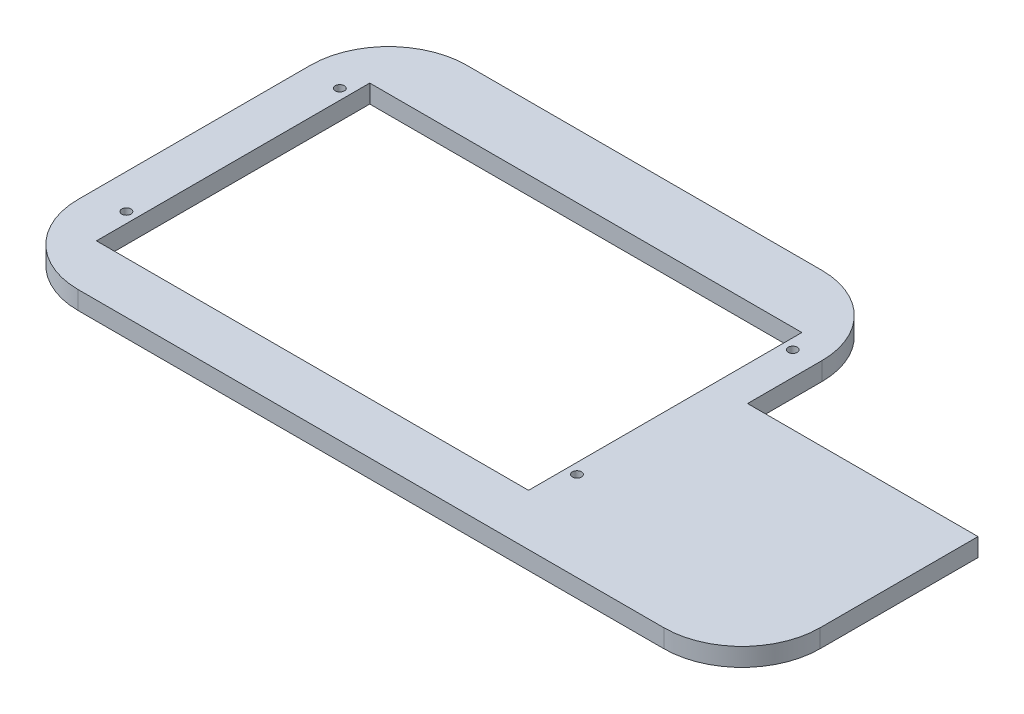
ISO-10303-21;
HEADER;
FILE_DESCRIPTION(('STEP AP214'),'2;1');
FILE_NAME('part.step','',(''),(''),'','','');
FILE_SCHEMA(('AUTOMOTIVE_DESIGN { 1 0 10303 214 1 1 1 1 }'));
ENDSEC;
DATA;
#1=APPLICATION_CONTEXT('core data for automotive mechanical design processes');
#2=APPLICATION_PROTOCOL_DEFINITION('international standard','automotive_design',2000,#1);
#3=PRODUCT_CONTEXT('',#1,'mechanical');
#4=PRODUCT('Part','Part','',(#3));
#5=PRODUCT_RELATED_PRODUCT_CATEGORY('part','',(#4));
#6=PRODUCT_DEFINITION_FORMATION('','',#4);
#7=PRODUCT_DEFINITION_CONTEXT('part definition',#1,'design');
#8=PRODUCT_DEFINITION('design','',#6,#7);
#9=PRODUCT_DEFINITION_SHAPE('','',#8);
#10=(LENGTH_UNIT() NAMED_UNIT(*) SI_UNIT(.MILLI.,.METRE.));
#11=(NAMED_UNIT(*) PLANE_ANGLE_UNIT() SI_UNIT($,.RADIAN.));
#12=(NAMED_UNIT(*) SI_UNIT($,.STERADIAN.) SOLID_ANGLE_UNIT());
#13=UNCERTAINTY_MEASURE_WITH_UNIT(LENGTH_MEASURE(1.E-05),#10,'distance_accuracy_value','');
#14=(GEOMETRIC_REPRESENTATION_CONTEXT(3) GLOBAL_UNCERTAINTY_ASSIGNED_CONTEXT((#13)) GLOBAL_UNIT_ASSIGNED_CONTEXT((#10,
#11,#12)) REPRESENTATION_CONTEXT('',''));
#15=CARTESIAN_POINT('',(0.,0.,0.));
#16=DIRECTION('',(0.,0.,1.));
#17=DIRECTION('',(1.,0.,0.));
#18=AXIS2_PLACEMENT_3D('',#15,#16,#17);
#19=CARTESIAN_POINT('',(-49.1774982545109,7.,0.));
#20=DIRECTION('',(1.,0.,0.));
#21=DIRECTION('',(0.,0.,-1.));
#22=AXIS2_PLACEMENT_3D('',#19,#20,#21);
#23=PLANE('',#22);
#24=DIRECTION('',(0.,0.,1.));
#25=VECTOR('',#24,1.);
#26=CARTESIAN_POINT('',(-49.1774982545109,0.,0.));
#27=LINE('',#26,#25);
#28=CARTESIAN_POINT('',(-49.1774982545109,0.,-12.2755631281144));
#29=VERTEX_POINT('',#28);
#30=CARTESIAN_POINT('',(-49.1774982545109,0.,76.9862026567759));
#31=VERTEX_POINT('',#30);
#32=EDGE_CURVE('E220',#29,#31,#27,.T.);
#33=ORIENTED_EDGE('',*,*,#32,.T.);
#34=DIRECTION('',(0.,-1.,0.));
#35=VECTOR('',#34,1.);
#36=CARTESIAN_POINT('',(-49.1774982545109,7.,76.9862026567759));
#37=LINE('',#36,#35);
#38=CARTESIAN_POINT('',(-49.1774982545109,7.,76.9862026567759));
#39=VERTEX_POINT('',#38);
#40=EDGE_CURVE('E11',#39,#31,#37,.T.);
#41=ORIENTED_EDGE('',*,*,#40,.F.);
#42=DIRECTION('',(0.,0.,1.));
#43=VECTOR('',#42,1.);
#44=CARTESIAN_POINT('',(-49.1774982545109,7.,0.));
#45=LINE('',#44,#43);
#46=CARTESIAN_POINT('',(-49.1774982545109,7.,-12.2755631281144));
#47=VERTEX_POINT('',#46);
#48=EDGE_CURVE('E307',#47,#39,#45,.T.);
#49=ORIENTED_EDGE('',*,*,#48,.F.);
#50=DIRECTION('',(0.,-1.,0.));
#51=VECTOR('',#50,1.);
#52=CARTESIAN_POINT('',(-49.1774982545109,7.,-12.2755631281144));
#53=LINE('',#52,#51);
#54=EDGE_CURVE('E244',#47,#29,#53,.T.);
#55=ORIENTED_EDGE('',*,*,#54,.T.);
#56=EDGE_LOOP('',(#33,#41,#49,#55));
#57=FACE_BOUND('',#56,.T.);
#58=ADVANCED_FACE('F35',(#57),#23,.F.);
#59=CARTESIAN_POINT('',(-19.1774982545109,7.,76.986202656776));
#60=DIRECTION('',(0.,-1.,0.));
#61=DIRECTION('',(0.,0.,-1.));
#62=AXIS2_PLACEMENT_3D('',#59,#60,#61);
#63=CYLINDRICAL_SURFACE('',#62,30.);
#64=CARTESIAN_POINT('',(-19.1774982545109,0.,76.986202656776));
#65=DIRECTION('',(0.,1.,0.));
#66=DIRECTION('',(0.,0.,1.));
#67=AXIS2_PLACEMENT_3D('',#64,#65,#66);
#68=CIRCLE('',#67,30.);
#69=CARTESIAN_POINT('',(-19.1774982545109,0.,106.986202656776));
#70=VERTEX_POINT('',#69);
#71=EDGE_CURVE('E223',#31,#70,#68,.T.);
#72=ORIENTED_EDGE('',*,*,#71,.T.);
#73=DIRECTION('',(0.,-1.,0.));
#74=VECTOR('',#73,1.);
#75=CARTESIAN_POINT('',(-19.1774982545109,7.,106.986202656776));
#76=LINE('',#75,#74);
#77=CARTESIAN_POINT('',(-19.1774982545109,7.,106.986202656776));
#78=VERTEX_POINT('',#77);
#79=EDGE_CURVE('E45',#78,#70,#76,.T.);
#80=ORIENTED_EDGE('',*,*,#79,.F.);
#81=CARTESIAN_POINT('',(-19.1774982545109,7.,76.986202656776));
#82=DIRECTION('',(0.,1.,0.));
#83=DIRECTION('',(0.,0.,1.));
#84=AXIS2_PLACEMENT_3D('',#81,#82,#83);
#85=CIRCLE('',#84,30.);
#86=EDGE_CURVE('E309',#39,#78,#85,.T.);
#87=ORIENTED_EDGE('',*,*,#86,.F.);
#88=ORIENTED_EDGE('',*,*,#40,.T.);
#89=EDGE_LOOP('',(#72,#80,#87,#88));
#90=FACE_BOUND('',#89,.T.);
#91=ADVANCED_FACE('F343',(#90),#63,.T.);
#92=CARTESIAN_POINT('',(0.,7.,106.986202656776));
#93=DIRECTION('',(0.,0.,-1.));
#94=DIRECTION('',(-1.,0.,0.));
#95=AXIS2_PLACEMENT_3D('',#92,#93,#94);
#96=PLANE('',#95);
#97=DIRECTION('',(1.,0.,0.));
#98=VECTOR('',#97,1.);
#99=CARTESIAN_POINT('',(0.,0.,106.986202656776));
#100=LINE('',#99,#98);
#101=CARTESIAN_POINT('',(205.849333343495,0.,106.986202656776));
#102=VERTEX_POINT('',#101);
#103=EDGE_CURVE('E225',#70,#102,#100,.T.);
#104=ORIENTED_EDGE('',*,*,#103,.T.);
#105=DIRECTION('',(0.,-1.,0.));
#106=VECTOR('',#105,1.);
#107=CARTESIAN_POINT('',(205.849333343495,7.,106.986202656776));
#108=LINE('',#107,#106);
#109=CARTESIAN_POINT('',(205.849333343495,7.,106.986202656776));
#110=VERTEX_POINT('',#109);
#111=EDGE_CURVE('E254',#110,#102,#108,.T.);
#112=ORIENTED_EDGE('',*,*,#111,.F.);
#113=DIRECTION('',(1.,0.,0.));
#114=VECTOR('',#113,1.);
#115=CARTESIAN_POINT('',(0.,7.,106.986202656776));
#116=LINE('',#115,#114);
#117=EDGE_CURVE('E311',#78,#110,#116,.T.);
#118=ORIENTED_EDGE('',*,*,#117,.F.);
#119=ORIENTED_EDGE('',*,*,#79,.T.);
#120=EDGE_LOOP('',(#104,#112,#118,#119));
#121=FACE_BOUND('',#120,.T.);
#122=ADVANCED_FACE('F348',(#121),#96,.F.);
#123=CARTESIAN_POINT('',(205.849333343495,7.,76.9862026567759));
#124=DIRECTION('',(0.,-1.,0.));
#125=DIRECTION('',(0.,0.,-1.));
#126=AXIS2_PLACEMENT_3D('',#123,#124,#125);
#127=CYLINDRICAL_SURFACE('',#126,30.);
#128=CARTESIAN_POINT('',(205.849333343495,0.,76.9862026567759));
#129=DIRECTION('',(0.,1.,0.));
#130=DIRECTION('',(0.,0.,1.));
#131=AXIS2_PLACEMENT_3D('',#128,#129,#130);
#132=CIRCLE('',#131,30.);
#133=CARTESIAN_POINT('',(235.849333343495,0.,76.9862026567759));
#134=VERTEX_POINT('',#133);
#135=EDGE_CURVE('E227',#102,#134,#132,.T.);
#136=ORIENTED_EDGE('',*,*,#135,.T.);
#137=DIRECTION('',(0.,-1.,0.));
#138=VECTOR('',#137,1.);
#139=CARTESIAN_POINT('',(235.849333343495,7.,76.9862026567759));
#140=LINE('',#139,#138);
#141=CARTESIAN_POINT('',(235.849333343495,7.,76.9862026567759));
#142=VERTEX_POINT('',#141);
#143=EDGE_CURVE('E252',#142,#134,#140,.T.);
#144=ORIENTED_EDGE('',*,*,#143,.F.);
#145=CARTESIAN_POINT('',(205.849333343495,7.,76.9862026567759));
#146=DIRECTION('',(0.,1.,0.));
#147=DIRECTION('',(0.,0.,1.));
#148=AXIS2_PLACEMENT_3D('',#145,#146,#147);
#149=CIRCLE('',#148,30.);
#150=EDGE_CURVE('E313',#110,#142,#149,.T.);
#151=ORIENTED_EDGE('',*,*,#150,.F.);
#152=ORIENTED_EDGE('',*,*,#111,.T.);
#153=EDGE_LOOP('',(#136,#144,#151,#152));
#154=FACE_BOUND('',#153,.T.);
#155=ADVANCED_FACE('F518',(#154),#127,.T.);
#156=CARTESIAN_POINT('',(235.849333343495,7.,-1.07912025322902E-13));
#157=DIRECTION('',(1.,0.,0.));
#158=DIRECTION('',(0.,0.,-1.));
#159=AXIS2_PLACEMENT_3D('',#156,#157,#158);
#160=PLANE('',#159);
#161=DIRECTION('',(0.,0.,1.));
#162=VECTOR('',#161,1.);
#163=CARTESIAN_POINT('',(235.849333343495,0.,-1.07912025322902E-13));
#164=LINE('',#163,#162);
#165=CARTESIAN_POINT('',(235.849333343495,0.,16.3244368718853));
#166=VERTEX_POINT('',#165);
#167=EDGE_CURVE('E230',#166,#134,#164,.T.);
#168=ORIENTED_EDGE('',*,*,#167,.F.);
#169=DIRECTION('',(0.,-1.,0.));
#170=VECTOR('',#169,1.);
#171=CARTESIAN_POINT('',(235.849333343495,7.,16.3244368718853));
#172=LINE('',#171,#170);
#173=CARTESIAN_POINT('',(235.849333343495,7.,16.3244368718853));
#174=VERTEX_POINT('',#173);
#175=EDGE_CURVE('E250',#174,#166,#172,.T.);
#176=ORIENTED_EDGE('',*,*,#175,.F.);
#177=DIRECTION('',(0.,0.,1.));
#178=VECTOR('',#177,1.);
#179=CARTESIAN_POINT('',(235.849333343495,7.,-1.07912025322902E-13));
#180=LINE('',#179,#178);
#181=EDGE_CURVE('E315',#174,#142,#180,.T.);
#182=ORIENTED_EDGE('',*,*,#181,.T.);
#183=ORIENTED_EDGE('',*,*,#143,.T.);
#184=EDGE_LOOP('',(#168,#176,#182,#183));
#185=FACE_BOUND('',#184,.T.);
#186=ADVANCED_FACE('F508',(#185),#160,.T.);
#187=CARTESIAN_POINT('',(0.,7.,16.3244368718859));
#188=DIRECTION('',(0.,0.,-1.));
#189=DIRECTION('',(-1.,0.,0.));
#190=AXIS2_PLACEMENT_3D('',#187,#188,#189);
#191=PLANE('',#190);
#192=DIRECTION('',(1.,0.,0.));
#193=VECTOR('',#192,1.);
#194=CARTESIAN_POINT('',(0.,0.,16.3244368718859));
#195=LINE('',#194,#193);
#196=CARTESIAN_POINT('',(147.322501745489,0.,16.3244368718855));
#197=VERTEX_POINT('',#196);
#198=EDGE_CURVE('E233',#197,#166,#195,.T.);
#199=ORIENTED_EDGE('',*,*,#198,.F.);
#200=DIRECTION('',(0.,-1.,0.));
#201=VECTOR('',#200,1.);
#202=CARTESIAN_POINT('',(147.322501745489,7.,16.3244368718855));
#203=LINE('',#202,#201);
#204=CARTESIAN_POINT('',(147.322501745489,7.,16.3244368718855));
#205=VERTEX_POINT('',#204);
#206=EDGE_CURVE('E248',#205,#197,#203,.T.);
#207=ORIENTED_EDGE('',*,*,#206,.F.);
#208=DIRECTION('',(1.,0.,0.));
#209=VECTOR('',#208,1.);
#210=CARTESIAN_POINT('',(0.,7.,16.3244368718859));
#211=LINE('',#210,#209);
#212=EDGE_CURVE('E318',#205,#174,#211,.T.);
#213=ORIENTED_EDGE('',*,*,#212,.T.);
#214=ORIENTED_EDGE('',*,*,#175,.T.);
#215=EDGE_LOOP('',(#199,#207,#213,#214));
#216=FACE_BOUND('',#215,.T.);
#217=ADVANCED_FACE('F499',(#216),#191,.T.);
#218=CARTESIAN_POINT('',(147.322501745489,7.,0.));
#219=DIRECTION('',(1.,0.,0.));
#220=DIRECTION('',(0.,0.,-1.));
#221=AXIS2_PLACEMENT_3D('',#218,#219,#220);
#222=PLANE('',#221);
#223=DIRECTION('',(0.,0.,1.));
#224=VECTOR('',#223,1.);
#225=CARTESIAN_POINT('',(147.322501745489,0.,0.));
#226=LINE('',#225,#224);
#227=CARTESIAN_POINT('',(147.322501745489,0.,-12.2755631281145));
#228=VERTEX_POINT('',#227);
#229=EDGE_CURVE('E236',#228,#197,#226,.T.);
#230=ORIENTED_EDGE('',*,*,#229,.F.);
#231=DIRECTION('',(0.,-1.,0.));
#232=VECTOR('',#231,1.);
#233=CARTESIAN_POINT('',(147.322501745489,7.,-12.2755631281145));
#234=LINE('',#233,#232);
#235=CARTESIAN_POINT('',(147.322501745489,7.,-12.2755631281145));
#236=VERTEX_POINT('',#235);
#237=EDGE_CURVE('E174',#236,#228,#234,.T.);
#238=ORIENTED_EDGE('',*,*,#237,.F.);
#239=DIRECTION('',(0.,0.,1.));
#240=VECTOR('',#239,1.);
#241=CARTESIAN_POINT('',(147.322501745489,7.,0.));
#242=LINE('',#241,#240);
#243=EDGE_CURVE('E181',#236,#205,#242,.T.);
#244=ORIENTED_EDGE('',*,*,#243,.T.);
#245=ORIENTED_EDGE('',*,*,#206,.T.);
#246=EDGE_LOOP('',(#230,#238,#244,#245));
#247=FACE_BOUND('',#246,.T.);
#248=ADVANCED_FACE('F322',(#247),#222,.T.);
#249=CARTESIAN_POINT('',(117.322501745489,7.,-12.2755631281144));
#250=DIRECTION('',(0.,-1.,0.));
#251=DIRECTION('',(0.,0.,-1.));
#252=AXIS2_PLACEMENT_3D('',#249,#250,#251);
#253=CYLINDRICAL_SURFACE('',#252,30.);
#254=CARTESIAN_POINT('',(117.322501745489,0.,-12.2755631281144));
#255=DIRECTION('',(0.,1.,0.));
#256=DIRECTION('',(0.,0.,1.));
#257=AXIS2_PLACEMENT_3D('',#254,#255,#256);
#258=CIRCLE('',#257,30.);
#259=CARTESIAN_POINT('',(117.322501745489,0.,-42.2755631281144));
#260=VERTEX_POINT('',#259);
#261=EDGE_CURVE('E169',#260,#228,#258,.F.);
#262=ORIENTED_EDGE('',*,*,#261,.F.);
#263=DIRECTION('',(0.,-1.,0.));
#264=VECTOR('',#263,1.);
#265=CARTESIAN_POINT('',(117.322501745489,7.,-42.2755631281144));
#266=LINE('',#265,#264);
#267=CARTESIAN_POINT('',(117.322501745489,7.,-42.2755631281144));
#268=VERTEX_POINT('',#267);
#269=EDGE_CURVE('E164',#268,#260,#266,.T.);
#270=ORIENTED_EDGE('',*,*,#269,.F.);
#271=CARTESIAN_POINT('',(117.322501745489,7.,-12.2755631281144));
#272=DIRECTION('',(0.,1.,0.));
#273=DIRECTION('',(0.,0.,1.));
#274=AXIS2_PLACEMENT_3D('',#271,#272,#273);
#275=CIRCLE('',#274,30.);
#276=EDGE_CURVE('E167',#268,#236,#275,.F.);
#277=ORIENTED_EDGE('',*,*,#276,.T.);
#278=ORIENTED_EDGE('',*,*,#237,.T.);
#279=EDGE_LOOP('',(#262,#270,#277,#278));
#280=FACE_BOUND('',#279,.T.);
#281=ADVANCED_FACE('F166',(#280),#253,.T.);
#282=CARTESIAN_POINT('',(0.,7.,-42.2755631281144));
#283=DIRECTION('',(0.,0.,-1.));
#284=DIRECTION('',(-1.,0.,0.));
#285=AXIS2_PLACEMENT_3D('',#282,#283,#284);
#286=PLANE('',#285);
#287=DIRECTION('',(1.,0.,0.));
#288=VECTOR('',#287,1.);
#289=CARTESIAN_POINT('',(0.,0.,-42.2755631281144));
#290=LINE('',#289,#288);
#291=CARTESIAN_POINT('',(-19.1774982545109,0.,-42.2755631281144));
#292=VERTEX_POINT('',#291);
#293=EDGE_CURVE('E240',#292,#260,#290,.T.);
#294=ORIENTED_EDGE('',*,*,#293,.F.);
#295=DIRECTION('',(0.,-1.,0.));
#296=VECTOR('',#295,1.);
#297=CARTESIAN_POINT('',(-19.1774982545109,7.,-42.2755631281144));
#298=LINE('',#297,#296);
#299=CARTESIAN_POINT('',(-19.1774982545109,7.,-42.2755631281144));
#300=VERTEX_POINT('',#299);
#301=EDGE_CURVE('E109',#300,#292,#298,.T.);
#302=ORIENTED_EDGE('',*,*,#301,.F.);
#303=DIRECTION('',(1.,0.,0.));
#304=VECTOR('',#303,1.);
#305=CARTESIAN_POINT('',(0.,7.,-42.2755631281144));
#306=LINE('',#305,#304);
#307=EDGE_CURVE('E178',#300,#268,#306,.T.);
#308=ORIENTED_EDGE('',*,*,#307,.T.);
#309=ORIENTED_EDGE('',*,*,#269,.T.);
#310=EDGE_LOOP('',(#294,#302,#308,#309));
#311=FACE_BOUND('',#310,.T.);
#312=ADVANCED_FACE('F183',(#311),#286,.T.);
#313=CARTESIAN_POINT('',(134.135306927539,7.,-0.0157958822943742));
#314=DIRECTION('',(0.999999993066196,0.,-0.000117760808445323));
#315=DIRECTION('',(-0.000117760808445323,0.,-0.999999993066196));
#316=AXIS2_PLACEMENT_3D('',#313,#314,#315);
#317=PLANE('',#316);
#318=DIRECTION('',(0.000117760808445323,0.,0.999999993066196));
#319=VECTOR('',#318,1.);
#320=CARTESIAN_POINT('',(134.135306927539,0.,-0.0157958822943742));
#321=LINE('',#320,#319);
#322=CARTESIAN_POINT('',(134.134103877235,0.,-10.231845790894));
#323=VERTEX_POINT('',#322);
#324=CARTESIAN_POINT('',(134.139344233106,0.,34.2681530141468));
#325=VERTEX_POINT('',#324);
#326=EDGE_CURVE('E201',#323,#325,#321,.T.);
#327=ORIENTED_EDGE('',*,*,#326,.T.);
#328=DIRECTION('',(0.,-1.,0.));
#329=VECTOR('',#328,1.);
#330=CARTESIAN_POINT('',(134.139344233106,7.,34.2681530141468));
#331=LINE('',#330,#329);
#332=CARTESIAN_POINT('',(134.139344233106,7.,34.2681530141468));
#333=VERTEX_POINT('',#332);
#334=EDGE_CURVE('E39',#333,#325,#331,.T.);
#335=ORIENTED_EDGE('',*,*,#334,.F.);
#336=DIRECTION('',(0.000117760808445323,0.,0.999999993066196));
#337=VECTOR('',#336,1.);
#338=CARTESIAN_POINT('',(134.135306927539,7.,-0.0157958822943742));
#339=LINE('',#338,#337);
#340=CARTESIAN_POINT('',(134.134103877235,7.,-10.231845790894));
#341=VERTEX_POINT('',#340);
#342=EDGE_CURVE('E576',#341,#333,#339,.T.);
#343=ORIENTED_EDGE('',*,*,#342,.F.);
#344=DIRECTION('',(0.,-1.,0.));
#345=VECTOR('',#344,1.);
#346=CARTESIAN_POINT('',(134.134103877235,7.,-10.231845790894));
#347=LINE('',#346,#345);
#348=EDGE_CURVE('E185',#341,#323,#347,.T.);
#349=ORIENTED_EDGE('',*,*,#348,.T.);
#350=EDGE_LOOP('',(#327,#335,#343,#349));
#351=FACE_BOUND('',#350,.T.);
#352=ADVANCED_FACE('F278',(#351),#317,.F.);
#353=CARTESIAN_POINT('',(134.144208121454,7.,0.0190504977610266));
#354=DIRECTION('',(0.999999989915862,0.,0.000142015058538125));
#355=DIRECTION('',(0.000142015058538125,0.,-0.999999989915862));
#356=AXIS2_PLACEMENT_3D('',#353,#354,#355);
#357=PLANE('',#356);
#358=DIRECTION('',(-0.000142015058538125,0.,0.999999989915862));
#359=VECTOR('',#358,1.);
#360=CARTESIAN_POINT('',(134.144208121454,0.,0.0190504977610266));
#361=LINE('',#360,#359);
#362=CARTESIAN_POINT('',(134.134103877235,0.,71.1681541304497));
#363=VERTEX_POINT('',#362);
#364=EDGE_CURVE('E204',#325,#363,#361,.T.);
#365=ORIENTED_EDGE('',*,*,#364,.T.);
#366=DIRECTION('',(0.,-1.,0.));
#367=VECTOR('',#366,1.);
#368=CARTESIAN_POINT('',(134.134103877235,7.,71.1681541304497));
#369=LINE('',#368,#367);
#370=CARTESIAN_POINT('',(134.134103877235,7.,71.1681541304497));
#371=VERTEX_POINT('',#370);
#372=EDGE_CURVE('E269',#371,#363,#369,.T.);
#373=ORIENTED_EDGE('',*,*,#372,.F.);
#374=DIRECTION('',(-0.000142015058538125,0.,0.999999989915862));
#375=VECTOR('',#374,1.);
#376=CARTESIAN_POINT('',(134.144208121454,7.,0.0190504977610266));
#377=LINE('',#376,#375);
#378=EDGE_CURVE('E121',#333,#371,#377,.T.);
#379=ORIENTED_EDGE('',*,*,#378,.F.);
#380=ORIENTED_EDGE('',*,*,#334,.T.);
#381=EDGE_LOOP('',(#365,#373,#379,#380));
#382=FACE_BOUND('',#381,.T.);
#383=ADVANCED_FACE('F274',(#382),#357,.F.);
#384=CARTESIAN_POINT('',(134.134103877235,7.,0.));
#385=DIRECTION('',(-1.,0.,0.));
#386=DIRECTION('',(0.,0.,1.));
#387=AXIS2_PLACEMENT_3D('',#384,#385,#386);
#388=PLANE('',#387);
#389=DIRECTION('',(0.,0.,-1.));
#390=VECTOR('',#389,1.);
#391=CARTESIAN_POINT('',(134.134103877235,0.,0.));
#392=LINE('',#391,#390);
#393=CARTESIAN_POINT('',(134.134103877235,0.,87.268154209106));
#394=VERTEX_POINT('',#393);
#395=EDGE_CURVE('E207',#394,#363,#392,.T.);
#396=ORIENTED_EDGE('',*,*,#395,.F.);
#397=DIRECTION('',(0.,-1.,0.));
#398=VECTOR('',#397,1.);
#399=CARTESIAN_POINT('',(134.134103877235,7.,87.268154209106));
#400=LINE('',#399,#398);
#401=CARTESIAN_POINT('',(134.134103877235,7.,87.268154209106));
#402=VERTEX_POINT('',#401);
#403=EDGE_CURVE('E268',#402,#394,#400,.T.);
#404=ORIENTED_EDGE('',*,*,#403,.F.);
#405=DIRECTION('',(0.,0.,-1.));
#406=VECTOR('',#405,1.);
#407=CARTESIAN_POINT('',(134.134103877235,7.,0.));
#408=LINE('',#407,#406);
#409=EDGE_CURVE('E288',#402,#371,#408,.T.);
#410=ORIENTED_EDGE('',*,*,#409,.T.);
#411=ORIENTED_EDGE('',*,*,#372,.T.);
#412=EDGE_LOOP('',(#396,#404,#410,#411));
#413=FACE_BOUND('',#412,.T.);
#414=ADVANCED_FACE('F286',(#413),#388,.T.);
#415=CARTESIAN_POINT('',(0.,7.,87.268154209106));
#416=DIRECTION('',(0.,0.,-1.));
#417=DIRECTION('',(-1.,0.,0.));
#418=AXIS2_PLACEMENT_3D('',#415,#416,#417);
#419=PLANE('',#418);
#420=DIRECTION('',(1.,0.,0.));
#421=VECTOR('',#420,1.);
#422=CARTESIAN_POINT('',(0.,0.,87.268154209106));
#423=LINE('',#422,#421);
#424=CARTESIAN_POINT('',(-31.8658961227652,0.,87.268154209106));
#425=VERTEX_POINT('',#424);
#426=EDGE_CURVE('E210',#425,#394,#423,.T.);
#427=ORIENTED_EDGE('',*,*,#426,.F.);
#428=DIRECTION('',(0.,-1.,0.));
#429=VECTOR('',#428,1.);
#430=CARTESIAN_POINT('',(-31.8658961227652,7.,87.268154209106));
#431=LINE('',#430,#429);
#432=CARTESIAN_POINT('',(-31.8658961227652,7.,87.268154209106));
#433=VERTEX_POINT('',#432);
#434=EDGE_CURVE('E266',#433,#425,#431,.T.);
#435=ORIENTED_EDGE('',*,*,#434,.F.);
#436=DIRECTION('',(1.,0.,0.));
#437=VECTOR('',#436,1.);
#438=CARTESIAN_POINT('',(0.,7.,87.268154209106));
#439=LINE('',#438,#437);
#440=EDGE_CURVE('E294',#433,#402,#439,.T.);
#441=ORIENTED_EDGE('',*,*,#440,.T.);
#442=ORIENTED_EDGE('',*,*,#403,.T.);
#443=EDGE_LOOP('',(#427,#435,#441,#442));
#444=FACE_BOUND('',#443,.T.);
#445=ADVANCED_FACE('F297',(#444),#419,.T.);
#446=CARTESIAN_POINT('',(-31.8658961227652,7.,0.));
#447=DIRECTION('',(1.,0.,0.));
#448=DIRECTION('',(0.,0.,-1.));
#449=AXIS2_PLACEMENT_3D('',#446,#447,#448);
#450=PLANE('',#449);
#451=DIRECTION('',(0.,0.,1.));
#452=VECTOR('',#451,1.);
#453=CARTESIAN_POINT('',(-31.8658961227652,0.,0.));
#454=LINE('',#453,#452);
#455=CARTESIAN_POINT('',(-31.8658961227652,0.,-17.731845790894));
#456=VERTEX_POINT('',#455);
#457=EDGE_CURVE('E213',#456,#425,#454,.T.);
#458=ORIENTED_EDGE('',*,*,#457,.F.);
#459=DIRECTION('',(0.,-1.,0.));
#460=VECTOR('',#459,1.);
#461=CARTESIAN_POINT('',(-31.8658961227652,7.,-17.731845790894));
#462=LINE('',#461,#460);
#463=CARTESIAN_POINT('',(-31.8658961227652,7.,-17.731845790894));
#464=VERTEX_POINT('',#463);
#465=EDGE_CURVE('E264',#464,#456,#462,.T.);
#466=ORIENTED_EDGE('',*,*,#465,.F.);
#467=DIRECTION('',(0.,0.,1.));
#468=VECTOR('',#467,1.);
#469=CARTESIAN_POINT('',(-31.8658961227652,7.,0.));
#470=LINE('',#469,#468);
#471=EDGE_CURVE('E298',#464,#433,#470,.T.);
#472=ORIENTED_EDGE('',*,*,#471,.T.);
#473=ORIENTED_EDGE('',*,*,#434,.T.);
#474=EDGE_LOOP('',(#458,#466,#472,#473));
#475=FACE_BOUND('',#474,.T.);
#476=ADVANCED_FACE('F361',(#475),#450,.T.);
#477=CARTESIAN_POINT('',(0.,7.,-17.731845790894));
#478=DIRECTION('',(0.,0.,-1.));
#479=DIRECTION('',(-1.,0.,0.));
#480=AXIS2_PLACEMENT_3D('',#477,#478,#479);
#481=PLANE('',#480);
#482=DIRECTION('',(1.,0.,0.));
#483=VECTOR('',#482,1.);
#484=CARTESIAN_POINT('',(0.,0.,-17.731845790894));
#485=LINE('',#484,#483);
#486=CARTESIAN_POINT('',(134.134103877235,0.,-17.731845790894));
#487=VERTEX_POINT('',#486);
#488=EDGE_CURVE('E216',#456,#487,#485,.T.);
#489=ORIENTED_EDGE('',*,*,#488,.T.);
#490=DIRECTION('',(0.,-1.,0.));
#491=VECTOR('',#490,1.);
#492=CARTESIAN_POINT('',(134.134103877235,7.,-17.731845790894));
#493=LINE('',#492,#491);
#494=CARTESIAN_POINT('',(134.134103877235,7.,-17.731845790894));
#495=VERTEX_POINT('',#494);
#496=EDGE_CURVE('E261',#495,#487,#493,.T.);
#497=ORIENTED_EDGE('',*,*,#496,.F.);
#498=DIRECTION('',(1.,0.,0.));
#499=VECTOR('',#498,1.);
#500=CARTESIAN_POINT('',(0.,7.,-17.731845790894));
#501=LINE('',#500,#499);
#502=EDGE_CURVE('E300',#464,#495,#501,.T.);
#503=ORIENTED_EDGE('',*,*,#502,.F.);
#504=ORIENTED_EDGE('',*,*,#465,.T.);
#505=EDGE_LOOP('',(#489,#497,#503,#504));
#506=FACE_BOUND('',#505,.T.);
#507=ADVANCED_FACE('F357',(#506),#481,.F.);
#508=CARTESIAN_POINT('',(134.134103877235,7.,0.));
#509=DIRECTION('',(1.,0.,0.));
#510=DIRECTION('',(0.,0.,-1.));
#511=AXIS2_PLACEMENT_3D('',#508,#509,#510);
#512=PLANE('',#511);
#513=DIRECTION('',(0.,0.,1.));
#514=VECTOR('',#513,1.);
#515=CARTESIAN_POINT('',(134.134103877235,0.,0.));
#516=LINE('',#515,#514);
#517=EDGE_CURVE('E218',#487,#323,#516,.T.);
#518=ORIENTED_EDGE('',*,*,#517,.T.);
#519=ORIENTED_EDGE('',*,*,#348,.F.);
#520=DIRECTION('',(0.,0.,1.));
#521=VECTOR('',#520,1.);
#522=CARTESIAN_POINT('',(134.134103877235,7.,0.));
#523=LINE('',#522,#521);
#524=EDGE_CURVE('E305',#495,#341,#523,.T.);
#525=ORIENTED_EDGE('',*,*,#524,.F.);
#526=ORIENTED_EDGE('',*,*,#496,.T.);
#527=EDGE_LOOP('',(#518,#519,#525,#526));
#528=FACE_BOUND('',#527,.T.);
#529=ADVANCED_FACE('F353',(#528),#512,.F.);
#530=CARTESIAN_POINT('',(-35.8658961227652,7.,71.768154209106));
#531=DIRECTION('',(0.,-1.,0.));
#532=DIRECTION('',(0.,0.,-1.));
#533=AXIS2_PLACEMENT_3D('',#530,#531,#532);
#534=CYLINDRICAL_SURFACE('',#533,1.75);
#535=CARTESIAN_POINT('',(-35.8658961227652,7.,71.768154209106));
#536=DIRECTION('',(0.,1.,0.));
#537=DIRECTION('',(0.,0.,1.));
#538=AXIS2_PLACEMENT_3D('',#535,#536,#537);
#539=CIRCLE('',#538,1.75);
#540=CARTESIAN_POINT('',(-35.8658961227652,7.,73.518154209106));
#541=VERTEX_POINT('',#540);
#542=EDGE_CURVE('E569',#541,#541,#539,.T.);
#543=ORIENTED_EDGE('',*,*,#542,.T.);
#544=EDGE_LOOP('',(#543));
#545=FACE_BOUND('',#544,.T.);
#546=CARTESIAN_POINT('',(-35.8658961227652,0.,71.768154209106));
#547=DIRECTION('',(0.,1.,0.));
#548=DIRECTION('',(0.,0.,1.));
#549=AXIS2_PLACEMENT_3D('',#546,#547,#548);
#550=CIRCLE('',#549,1.75);
#551=CARTESIAN_POINT('',(-35.8658961227652,0.,73.518154209106));
#552=VERTEX_POINT('',#551);
#553=EDGE_CURVE('E198',#552,#552,#550,.T.);
#554=ORIENTED_EDGE('',*,*,#553,.F.);
#555=EDGE_LOOP('',(#554));
#556=FACE_BOUND('',#555,.T.);
#557=ADVANCED_FACE('F356',(#545,#556),#534,.F.);
#558=CARTESIAN_POINT('',(-35.8658961227652,7.,-10.231845790894));
#559=DIRECTION('',(0.,-1.,0.));
#560=DIRECTION('',(0.,0.,-1.));
#561=AXIS2_PLACEMENT_3D('',#558,#559,#560);
#562=CYLINDRICAL_SURFACE('',#561,1.75);
#563=CARTESIAN_POINT('',(-35.8658961227652,7.,-10.231845790894));
#564=DIRECTION('',(0.,1.,0.));
#565=DIRECTION('',(0.,0.,1.));
#566=AXIS2_PLACEMENT_3D('',#563,#564,#565);
#567=CIRCLE('',#566,1.75);
#568=CARTESIAN_POINT('',(-35.8658961227652,7.,-8.48184579089403));
#569=VERTEX_POINT('',#568);
#570=EDGE_CURVE('E566',#569,#569,#567,.T.);
#571=ORIENTED_EDGE('',*,*,#570,.T.);
#572=EDGE_LOOP('',(#571));
#573=FACE_BOUND('',#572,.T.);
#574=CARTESIAN_POINT('',(-35.8658961227652,0.,-10.231845790894));
#575=DIRECTION('',(0.,1.,0.));
#576=DIRECTION('',(0.,0.,1.));
#577=AXIS2_PLACEMENT_3D('',#574,#575,#576);
#578=CIRCLE('',#577,1.75);
#579=CARTESIAN_POINT('',(-35.8658961227652,0.,-8.48184579089403));
#580=VERTEX_POINT('',#579);
#581=EDGE_CURVE('E195',#580,#580,#578,.T.);
#582=ORIENTED_EDGE('',*,*,#581,.F.);
#583=EDGE_LOOP('',(#582));
#584=FACE_BOUND('',#583,.T.);
#585=ADVANCED_FACE('F376',(#573,#584),#562,.F.);
#586=CARTESIAN_POINT('',(138.134103877235,7.,72.6831119149943));
#587=DIRECTION('',(0.,-1.,0.));
#588=DIRECTION('',(0.,0.,-1.));
#589=AXIS2_PLACEMENT_3D('',#586,#587,#588);
#590=CYLINDRICAL_SURFACE('',#589,1.75000000000001);
#591=CARTESIAN_POINT('',(138.134103877235,7.,72.6831119149943));
#592=DIRECTION('',(0.,1.,0.));
#593=DIRECTION('',(0.,0.,1.));
#594=AXIS2_PLACEMENT_3D('',#591,#592,#593);
#595=CIRCLE('',#594,1.75000000000001);
#596=CARTESIAN_POINT('',(138.134103877235,7.,74.4331119149943));
#597=VERTEX_POINT('',#596);
#598=EDGE_CURVE('E387',#597,#597,#595,.T.);
#599=ORIENTED_EDGE('',*,*,#598,.T.);
#600=EDGE_LOOP('',(#599));
#601=FACE_BOUND('',#600,.T.);
#602=CARTESIAN_POINT('',(138.134103877235,0.,72.6831119149943));
#603=DIRECTION('',(0.,1.,0.));
#604=DIRECTION('',(0.,0.,1.));
#605=AXIS2_PLACEMENT_3D('',#602,#603,#604);
#606=CIRCLE('',#605,1.75000000000001);
#607=CARTESIAN_POINT('',(138.134103877235,0.,74.4331119149943));
#608=VERTEX_POINT('',#607);
#609=EDGE_CURVE('E192',#608,#608,#606,.T.);
#610=ORIENTED_EDGE('',*,*,#609,.F.);
#611=EDGE_LOOP('',(#610));
#612=FACE_BOUND('',#611,.T.);
#613=ADVANCED_FACE('F338',(#601,#612),#590,.F.);
#614=CARTESIAN_POINT('',(138.134103877235,7.,-10.231845790894));
#615=DIRECTION('',(0.,-1.,0.));
#616=DIRECTION('',(0.,0.,-1.));
#617=AXIS2_PLACEMENT_3D('',#614,#615,#616);
#618=CYLINDRICAL_SURFACE('',#617,1.75000000000001);
#619=CARTESIAN_POINT('',(138.134103877235,7.,-10.231845790894));
#620=DIRECTION('',(0.,1.,0.));
#621=DIRECTION('',(0.,0.,1.));
#622=AXIS2_PLACEMENT_3D('',#619,#620,#621);
#623=CIRCLE('',#622,1.75000000000001);
#624=CARTESIAN_POINT('',(138.134103877235,7.,-8.48184579089403));
#625=VERTEX_POINT('',#624);
#626=EDGE_CURVE('E243',#625,#625,#623,.T.);
#627=ORIENTED_EDGE('',*,*,#626,.T.);
#628=EDGE_LOOP('',(#627));
#629=FACE_BOUND('',#628,.T.);
#630=CARTESIAN_POINT('',(138.134103877235,0.,-10.231845790894));
#631=DIRECTION('',(0.,1.,0.));
#632=DIRECTION('',(0.,0.,1.));
#633=AXIS2_PLACEMENT_3D('',#630,#631,#632);
#634=CIRCLE('',#633,1.75000000000001);
#635=CARTESIAN_POINT('',(138.134103877235,0.,-8.48184579089403));
#636=VERTEX_POINT('',#635);
#637=EDGE_CURVE('E189',#636,#636,#634,.T.);
#638=ORIENTED_EDGE('',*,*,#637,.F.);
#639=EDGE_LOOP('',(#638));
#640=FACE_BOUND('',#639,.T.);
#641=ADVANCED_FACE('F37',(#629,#640),#618,.F.);
#642=CARTESIAN_POINT('',(-19.1774982545109,7.,-12.2755631281144));
#643=DIRECTION('',(0.,-1.,0.));
#644=DIRECTION('',(0.,0.,-1.));
#645=AXIS2_PLACEMENT_3D('',#642,#643,#644);
#646=CYLINDRICAL_SURFACE('',#645,30.);
#647=CARTESIAN_POINT('',(-19.1774982545109,0.,-12.2755631281144));
#648=DIRECTION('',(0.,1.,0.));
#649=DIRECTION('',(0.,0.,1.));
#650=AXIS2_PLACEMENT_3D('',#647,#648,#649);
#651=CIRCLE('',#650,30.);
#652=EDGE_CURVE('E112',#292,#29,#651,.T.);
#653=ORIENTED_EDGE('',*,*,#652,.T.);
#654=ORIENTED_EDGE('',*,*,#54,.F.);
#655=CARTESIAN_POINT('',(-19.1774982545109,7.,-12.2755631281144));
#656=DIRECTION('',(0.,1.,0.));
#657=DIRECTION('',(0.,0.,1.));
#658=AXIS2_PLACEMENT_3D('',#655,#656,#657);
#659=CIRCLE('',#658,30.);
#660=EDGE_CURVE('E54',#300,#47,#659,.T.);
#661=ORIENTED_EDGE('',*,*,#660,.F.);
#662=ORIENTED_EDGE('',*,*,#301,.T.);
#663=EDGE_LOOP('',(#653,#654,#661,#662));
#664=FACE_BOUND('',#663,.T.);
#665=ADVANCED_FACE('F329',(#664),#646,.T.);
#666=CARTESIAN_POINT('',(0.,7.,0.));
#667=DIRECTION('',(0.,1.,0.));
#668=DIRECTION('',(0.,0.,1.));
#669=AXIS2_PLACEMENT_3D('',#666,#667,#668);
#670=PLANE('',#669);
#671=ORIENTED_EDGE('',*,*,#626,.F.);
#672=EDGE_LOOP('',(#671));
#673=FACE_BOUND('',#672,.T.);
#674=ORIENTED_EDGE('',*,*,#598,.F.);
#675=EDGE_LOOP('',(#674));
#676=FACE_BOUND('',#675,.T.);
#677=ORIENTED_EDGE('',*,*,#570,.F.);
#678=EDGE_LOOP('',(#677));
#679=FACE_BOUND('',#678,.T.);
#680=ORIENTED_EDGE('',*,*,#542,.F.);
#681=EDGE_LOOP('',(#680));
#682=FACE_BOUND('',#681,.T.);
#683=ORIENTED_EDGE('',*,*,#342,.T.);
#684=ORIENTED_EDGE('',*,*,#378,.T.);
#685=ORIENTED_EDGE('',*,*,#409,.F.);
#686=ORIENTED_EDGE('',*,*,#440,.F.);
#687=ORIENTED_EDGE('',*,*,#471,.F.);
#688=ORIENTED_EDGE('',*,*,#502,.T.);
#689=ORIENTED_EDGE('',*,*,#524,.T.);
#690=EDGE_LOOP('',(#683,#684,#685,#686,#687,#688,#689));
#691=FACE_BOUND('',#690,.T.);
#692=ORIENTED_EDGE('',*,*,#48,.T.);
#693=ORIENTED_EDGE('',*,*,#86,.T.);
#694=ORIENTED_EDGE('',*,*,#117,.T.);
#695=ORIENTED_EDGE('',*,*,#150,.T.);
#696=ORIENTED_EDGE('',*,*,#181,.F.);
#697=ORIENTED_EDGE('',*,*,#212,.F.);
#698=ORIENTED_EDGE('',*,*,#243,.F.);
#699=ORIENTED_EDGE('',*,*,#276,.F.);
#700=ORIENTED_EDGE('',*,*,#307,.F.);
#701=ORIENTED_EDGE('',*,*,#660,.T.);
#702=EDGE_LOOP('',(#692,#693,#694,#695,#696,#697,#698,#699,#700,#701));
#703=FACE_BOUND('',#702,.T.);
#704=ADVANCED_FACE('F177',(#673,#676,#679,#682,#691,#703),#670,.T.);
#705=CARTESIAN_POINT('',(0.,0.,0.));
#706=DIRECTION('',(0.,1.,0.));
#707=DIRECTION('',(0.,0.,1.));
#708=AXIS2_PLACEMENT_3D('',#705,#706,#707);
#709=PLANE('',#708);
#710=ORIENTED_EDGE('',*,*,#637,.T.);
#711=EDGE_LOOP('',(#710));
#712=FACE_BOUND('',#711,.T.);
#713=ORIENTED_EDGE('',*,*,#609,.T.);
#714=EDGE_LOOP('',(#713));
#715=FACE_BOUND('',#714,.T.);
#716=ORIENTED_EDGE('',*,*,#581,.T.);
#717=EDGE_LOOP('',(#716));
#718=FACE_BOUND('',#717,.T.);
#719=ORIENTED_EDGE('',*,*,#553,.T.);
#720=EDGE_LOOP('',(#719));
#721=FACE_BOUND('',#720,.T.);
#722=ORIENTED_EDGE('',*,*,#326,.F.);
#723=ORIENTED_EDGE('',*,*,#517,.F.);
#724=ORIENTED_EDGE('',*,*,#488,.F.);
#725=ORIENTED_EDGE('',*,*,#457,.T.);
#726=ORIENTED_EDGE('',*,*,#426,.T.);
#727=ORIENTED_EDGE('',*,*,#395,.T.);
#728=ORIENTED_EDGE('',*,*,#364,.F.);
#729=EDGE_LOOP('',(#722,#723,#724,#725,#726,#727,#728));
#730=FACE_BOUND('',#729,.T.);
#731=ORIENTED_EDGE('',*,*,#32,.F.);
#732=ORIENTED_EDGE('',*,*,#652,.F.);
#733=ORIENTED_EDGE('',*,*,#293,.T.);
#734=ORIENTED_EDGE('',*,*,#261,.T.);
#735=ORIENTED_EDGE('',*,*,#229,.T.);
#736=ORIENTED_EDGE('',*,*,#198,.T.);
#737=ORIENTED_EDGE('',*,*,#167,.T.);
#738=ORIENTED_EDGE('',*,*,#135,.F.);
#739=ORIENTED_EDGE('',*,*,#103,.F.);
#740=ORIENTED_EDGE('',*,*,#71,.F.);
#741=EDGE_LOOP('',(#731,#732,#733,#734,#735,#736,#737,#738,#739,#740));
#742=FACE_BOUND('',#741,.T.);
#743=ADVANCED_FACE('F282',(#712,#715,#718,#721,#730,#742),#709,.F.);
#744=CLOSED_SHELL('',(#58,#91,#122,#155,#186,#217,#248,#281,#312,#352,#383,#414,#445,#476,#507,
#529,#557,#585,#613,#641,#665,#704,#743));
#745=MANIFOLD_SOLID_BREP('B2',#744);
#746=ADVANCED_BREP_SHAPE_REPRESENTATION('',(#18,#745),#14);
#747=SHAPE_DEFINITION_REPRESENTATION(#9,#746);
ENDSEC;
END-ISO-10303-21;
